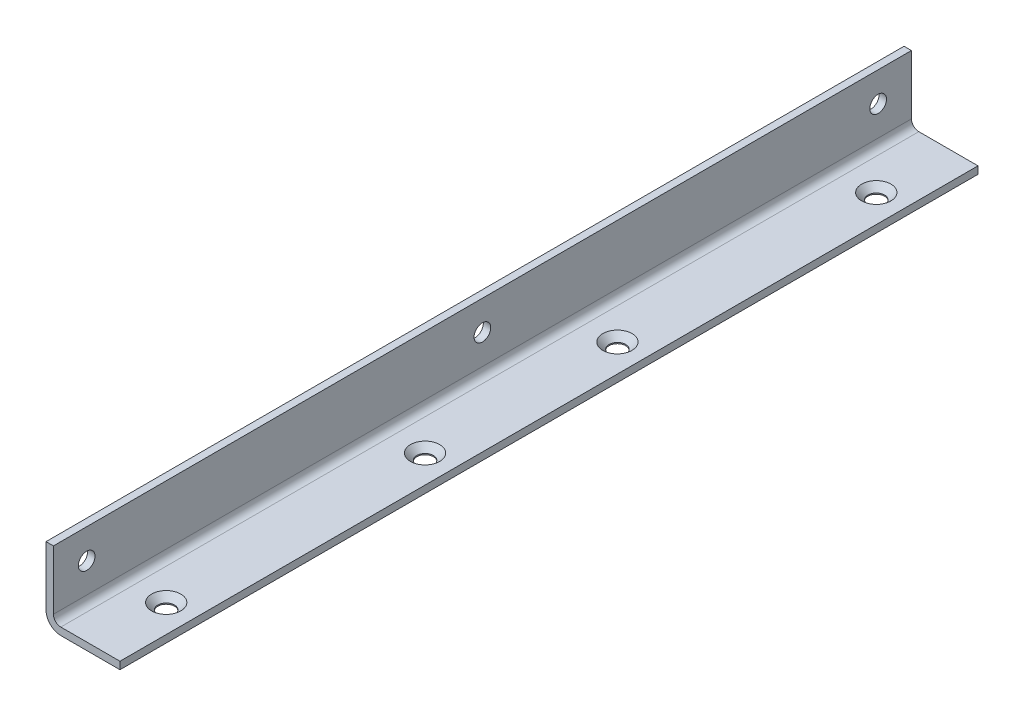
ISO-10303-21;
HEADER;
FILE_DESCRIPTION(('STEP AP214'),'2;1');
FILE_NAME('part.step','',(''),(''),'','','');
FILE_SCHEMA(('AUTOMOTIVE_DESIGN { 1 0 10303 214 1 1 1 1 }'));
ENDSEC;
DATA;
#1=APPLICATION_CONTEXT('core data for automotive mechanical design processes');
#2=APPLICATION_PROTOCOL_DEFINITION('international standard','automotive_design',2000,#1);
#3=PRODUCT_CONTEXT('',#1,'mechanical');
#4=PRODUCT('Part','Part','',(#3));
#5=PRODUCT_RELATED_PRODUCT_CATEGORY('part','',(#4));
#6=PRODUCT_DEFINITION_FORMATION('','',#4);
#7=PRODUCT_DEFINITION_CONTEXT('part definition',#1,'design');
#8=PRODUCT_DEFINITION('design','',#6,#7);
#9=PRODUCT_DEFINITION_SHAPE('','',#8);
#10=(LENGTH_UNIT() NAMED_UNIT(*) SI_UNIT(.MILLI.,.METRE.));
#11=(NAMED_UNIT(*) PLANE_ANGLE_UNIT() SI_UNIT($,.RADIAN.));
#12=(NAMED_UNIT(*) SI_UNIT($,.STERADIAN.) SOLID_ANGLE_UNIT());
#13=UNCERTAINTY_MEASURE_WITH_UNIT(LENGTH_MEASURE(1.E-05),#10,'distance_accuracy_value','');
#14=(GEOMETRIC_REPRESENTATION_CONTEXT(3) GLOBAL_UNCERTAINTY_ASSIGNED_CONTEXT((#13)) GLOBAL_UNIT_ASSIGNED_CONTEXT((#10,
#11,#12)) REPRESENTATION_CONTEXT('',''));
#15=CARTESIAN_POINT('',(0.,0.,0.));
#16=DIRECTION('',(0.,0.,1.));
#17=DIRECTION('',(1.,0.,0.));
#18=AXIS2_PLACEMENT_3D('',#15,#16,#17);
#19=CARTESIAN_POINT('',(0.,0.,232.));
#20=DIRECTION('',(1.,0.,0.));
#21=DIRECTION('',(0.,0.,-1.));
#22=AXIS2_PLACEMENT_3D('',#19,#20,#21);
#23=PLANE('',#22);
#24=CARTESIAN_POINT('',(0.,12.,116.));
#25=DIRECTION('',(1.,0.,0.));
#26=DIRECTION('',(0.,0.,-1.));
#27=AXIS2_PLACEMENT_3D('',#24,#25,#26);
#28=CIRCLE('',#27,2.25);
#29=CARTESIAN_POINT('',(0.,12.,113.75));
#30=VERTEX_POINT('',#29);
#31=EDGE_CURVE('E276',#30,#30,#28,.T.);
#32=ORIENTED_EDGE('',*,*,#31,.T.);
#33=EDGE_LOOP('',(#32));
#34=FACE_BOUND('',#33,.T.);
#35=CARTESIAN_POINT('',(0.,12.,9.00000000000007));
#36=DIRECTION('',(1.,0.,0.));
#37=DIRECTION('',(0.,0.,-1.));
#38=AXIS2_PLACEMENT_3D('',#35,#36,#37);
#39=CIRCLE('',#38,2.25);
#40=CARTESIAN_POINT('',(0.,12.,6.75000000000007));
#41=VERTEX_POINT('',#40);
#42=EDGE_CURVE('E281',#41,#41,#39,.T.);
#43=ORIENTED_EDGE('',*,*,#42,.T.);
#44=EDGE_LOOP('',(#43));
#45=FACE_BOUND('',#44,.T.);
#46=CARTESIAN_POINT('',(0.,12.,223.));
#47=DIRECTION('',(1.,0.,0.));
#48=DIRECTION('',(0.,0.,-1.));
#49=AXIS2_PLACEMENT_3D('',#46,#47,#48);
#50=CIRCLE('',#49,2.25000000000001);
#51=CARTESIAN_POINT('',(0.,12.,220.75));
#52=VERTEX_POINT('',#51);
#53=EDGE_CURVE('E147',#52,#52,#50,.T.);
#54=ORIENTED_EDGE('',*,*,#53,.T.);
#55=EDGE_LOOP('',(#54));
#56=FACE_BOUND('',#55,.T.);
#57=DIRECTION('',(0.,-1.,0.));
#58=VECTOR('',#57,1.);
#59=CARTESIAN_POINT('',(0.,0.,0.));
#60=LINE('',#59,#58);
#61=CARTESIAN_POINT('',(0.,20.,0.));
#62=VERTEX_POINT('',#61);
#63=CARTESIAN_POINT('',(0.,4.,0.));
#64=VERTEX_POINT('',#63);
#65=EDGE_CURVE('E145',#62,#64,#60,.T.);
#66=ORIENTED_EDGE('',*,*,#65,.T.);
#67=DIRECTION('',(0.,0.,-1.));
#68=VECTOR('',#67,1.);
#69=CARTESIAN_POINT('',(0.,4.,232.));
#70=LINE('',#69,#68);
#71=CARTESIAN_POINT('',(0.,4.,232.));
#72=VERTEX_POINT('',#71);
#73=EDGE_CURVE('E53',#64,#72,#70,.F.);
#74=ORIENTED_EDGE('',*,*,#73,.T.);
#75=DIRECTION('',(0.,-1.,0.));
#76=VECTOR('',#75,1.);
#77=CARTESIAN_POINT('',(0.,0.,232.));
#78=LINE('',#77,#76);
#79=CARTESIAN_POINT('',(0.,20.,232.));
#80=VERTEX_POINT('',#79);
#81=EDGE_CURVE('E119',#80,#72,#78,.T.);
#82=ORIENTED_EDGE('',*,*,#81,.F.);
#83=DIRECTION('',(0.,0.,-1.));
#84=VECTOR('',#83,1.);
#85=CARTESIAN_POINT('',(0.,20.,232.));
#86=LINE('',#85,#84);
#87=EDGE_CURVE('E144',#80,#62,#86,.T.);
#88=ORIENTED_EDGE('',*,*,#87,.T.);
#89=EDGE_LOOP('',(#66,#74,#82,#88));
#90=FACE_BOUND('',#89,.T.);
#91=ADVANCED_FACE('F45',(#34,#45,#56,#90),#23,.F.);
#92=CARTESIAN_POINT('',(0.,0.,232.));
#93=DIRECTION('',(0.,1.,0.));
#94=DIRECTION('',(0.,0.,1.));
#95=AXIS2_PLACEMENT_3D('',#92,#93,#94);
#96=PLANE('',#95);
#97=CARTESIAN_POINT('',(12.5,0.,90.));
#98=DIRECTION('',(0.,1.,0.));
#99=DIRECTION('',(0.,0.,1.));
#100=AXIS2_PLACEMENT_3D('',#97,#98,#99);
#101=CIRCLE('',#100,2.25);
#102=CARTESIAN_POINT('',(12.5,0.,92.25));
#103=VERTEX_POINT('',#102);
#104=EDGE_CURVE('E270',#103,#103,#101,.T.);
#105=ORIENTED_EDGE('',*,*,#104,.T.);
#106=EDGE_LOOP('',(#105));
#107=FACE_BOUND('',#106,.T.);
#108=CARTESIAN_POINT('',(12.5,0.,20.));
#109=DIRECTION('',(0.,1.,0.));
#110=DIRECTION('',(0.,0.,1.));
#111=AXIS2_PLACEMENT_3D('',#108,#109,#110);
#112=CIRCLE('',#111,2.25);
#113=CARTESIAN_POINT('',(12.5,0.,22.25));
#114=VERTEX_POINT('',#113);
#115=EDGE_CURVE('E264',#114,#114,#112,.T.);
#116=ORIENTED_EDGE('',*,*,#115,.T.);
#117=EDGE_LOOP('',(#116));
#118=FACE_BOUND('',#117,.T.);
#119=CARTESIAN_POINT('',(12.5,0.,142.));
#120=DIRECTION('',(0.,1.,0.));
#121=DIRECTION('',(0.,0.,1.));
#122=AXIS2_PLACEMENT_3D('',#119,#120,#121);
#123=CIRCLE('',#122,2.25);
#124=CARTESIAN_POINT('',(12.5,0.,144.25));
#125=VERTEX_POINT('',#124);
#126=EDGE_CURVE('E261',#125,#125,#123,.T.);
#127=ORIENTED_EDGE('',*,*,#126,.T.);
#128=EDGE_LOOP('',(#127));
#129=FACE_BOUND('',#128,.T.);
#130=CARTESIAN_POINT('',(12.5,0.,212.));
#131=DIRECTION('',(0.,1.,0.));
#132=DIRECTION('',(0.,0.,1.));
#133=AXIS2_PLACEMENT_3D('',#130,#131,#132);
#134=CIRCLE('',#133,2.25);
#135=CARTESIAN_POINT('',(12.5,0.,214.25));
#136=VERTEX_POINT('',#135);
#137=EDGE_CURVE('E263',#136,#136,#134,.T.);
#138=ORIENTED_EDGE('',*,*,#137,.T.);
#139=EDGE_LOOP('',(#138));
#140=FACE_BOUND('',#139,.T.);
#141=DIRECTION('',(1.,0.,0.));
#142=VECTOR('',#141,1.);
#143=CARTESIAN_POINT('',(0.,0.,232.));
#144=LINE('',#143,#142);
#145=CARTESIAN_POINT('',(4.,0.,232.));
#146=VERTEX_POINT('',#145);
#147=CARTESIAN_POINT('',(20.,0.,232.));
#148=VERTEX_POINT('',#147);
#149=EDGE_CURVE('E109',#146,#148,#144,.T.);
#150=ORIENTED_EDGE('',*,*,#149,.F.);
#151=DIRECTION('',(0.,0.,-1.));
#152=VECTOR('',#151,1.);
#153=CARTESIAN_POINT('',(4.,0.,232.));
#154=LINE('',#153,#152);
#155=CARTESIAN_POINT('',(4.,0.,0.));
#156=VERTEX_POINT('',#155);
#157=EDGE_CURVE('E194',#146,#156,#154,.T.);
#158=ORIENTED_EDGE('',*,*,#157,.T.);
#159=DIRECTION('',(1.,0.,0.));
#160=VECTOR('',#159,1.);
#161=CARTESIAN_POINT('',(0.,0.,0.));
#162=LINE('',#161,#160);
#163=CARTESIAN_POINT('',(20.,0.,0.));
#164=VERTEX_POINT('',#163);
#165=EDGE_CURVE('E124',#156,#164,#162,.T.);
#166=ORIENTED_EDGE('',*,*,#165,.T.);
#167=DIRECTION('',(0.,0.,-1.));
#168=VECTOR('',#167,1.);
#169=CARTESIAN_POINT('',(20.,0.,232.));
#170=LINE('',#169,#168);
#171=EDGE_CURVE('E122',#148,#164,#170,.T.);
#172=ORIENTED_EDGE('',*,*,#171,.F.);
#173=EDGE_LOOP('',(#150,#158,#166,#172));
#174=FACE_BOUND('',#173,.T.);
#175=ADVANCED_FACE('F123',(#107,#118,#129,#140,#174),#96,.F.);
#176=CARTESIAN_POINT('',(20.,0.,232.));
#177=DIRECTION('',(-1.,0.,0.));
#178=DIRECTION('',(0.,0.,1.));
#179=AXIS2_PLACEMENT_3D('',#176,#177,#178);
#180=PLANE('',#179);
#181=DIRECTION('',(0.,1.,0.));
#182=VECTOR('',#181,1.);
#183=CARTESIAN_POINT('',(20.,0.,0.));
#184=LINE('',#183,#182);
#185=CARTESIAN_POINT('',(20.,2.,0.));
#186=VERTEX_POINT('',#185);
#187=EDGE_CURVE('E149',#164,#186,#184,.T.);
#188=ORIENTED_EDGE('',*,*,#187,.T.);
#189=DIRECTION('',(0.,0.,-1.));
#190=VECTOR('',#189,1.);
#191=CARTESIAN_POINT('',(20.,2.,232.));
#192=LINE('',#191,#190);
#193=CARTESIAN_POINT('',(20.,2.,232.));
#194=VERTEX_POINT('',#193);
#195=EDGE_CURVE('E128',#194,#186,#192,.T.);
#196=ORIENTED_EDGE('',*,*,#195,.F.);
#197=DIRECTION('',(0.,1.,0.));
#198=VECTOR('',#197,1.);
#199=CARTESIAN_POINT('',(20.,0.,232.));
#200=LINE('',#199,#198);
#201=EDGE_CURVE('E113',#148,#194,#200,.T.);
#202=ORIENTED_EDGE('',*,*,#201,.F.);
#203=ORIENTED_EDGE('',*,*,#171,.T.);
#204=EDGE_LOOP('',(#188,#196,#202,#203));
#205=FACE_BOUND('',#204,.T.);
#206=ADVANCED_FACE('F130',(#205),#180,.F.);
#207=CARTESIAN_POINT('',(4.00000000000001,2.,232.));
#208=DIRECTION('',(0.,-1.,0.));
#209=DIRECTION('',(0.,0.,-1.));
#210=AXIS2_PLACEMENT_3D('',#207,#208,#209);
#211=PLANE('',#210);
#212=CARTESIAN_POINT('',(12.5,2.,20.));
#213=DIRECTION('',(0.,-1.,0.));
#214=DIRECTION('',(0.,0.,-1.));
#215=AXIS2_PLACEMENT_3D('',#212,#213,#214);
#216=CIRCLE('',#215,3.95000000000001);
#217=CARTESIAN_POINT('',(12.5,2.,16.05));
#218=VERTEX_POINT('',#217);
#219=EDGE_CURVE('E182',#218,#218,#216,.T.);
#220=ORIENTED_EDGE('',*,*,#219,.T.);
#221=EDGE_LOOP('',(#220));
#222=FACE_BOUND('',#221,.T.);
#223=CARTESIAN_POINT('',(12.5,2.,90.));
#224=DIRECTION('',(0.,-1.,0.));
#225=DIRECTION('',(0.,0.,-1.));
#226=AXIS2_PLACEMENT_3D('',#223,#224,#225);
#227=CIRCLE('',#226,3.95000000000001);
#228=CARTESIAN_POINT('',(12.5,2.,86.05));
#229=VERTEX_POINT('',#228);
#230=EDGE_CURVE('E179',#229,#229,#227,.T.);
#231=ORIENTED_EDGE('',*,*,#230,.T.);
#232=EDGE_LOOP('',(#231));
#233=FACE_BOUND('',#232,.T.);
#234=CARTESIAN_POINT('',(12.5,2.,142.));
#235=DIRECTION('',(0.,-1.,0.));
#236=DIRECTION('',(0.,0.,-1.));
#237=AXIS2_PLACEMENT_3D('',#234,#235,#236);
#238=CIRCLE('',#237,3.95000000000001);
#239=CARTESIAN_POINT('',(12.5,2.,138.05));
#240=VERTEX_POINT('',#239);
#241=EDGE_CURVE('E176',#240,#240,#238,.T.);
#242=ORIENTED_EDGE('',*,*,#241,.T.);
#243=EDGE_LOOP('',(#242));
#244=FACE_BOUND('',#243,.T.);
#245=CARTESIAN_POINT('',(12.5,2.,212.));
#246=DIRECTION('',(0.,-1.,0.));
#247=DIRECTION('',(0.,0.,-1.));
#248=AXIS2_PLACEMENT_3D('',#245,#246,#247);
#249=CIRCLE('',#248,3.95000000000001);
#250=CARTESIAN_POINT('',(12.5,2.,208.05));
#251=VERTEX_POINT('',#250);
#252=EDGE_CURVE('E173',#251,#251,#249,.T.);
#253=ORIENTED_EDGE('',*,*,#252,.T.);
#254=EDGE_LOOP('',(#253));
#255=FACE_BOUND('',#254,.T.);
#256=DIRECTION('',(-1.,0.,0.));
#257=VECTOR('',#256,1.);
#258=CARTESIAN_POINT('',(4.00000000000001,2.,0.));
#259=LINE('',#258,#257);
#260=CARTESIAN_POINT('',(4.00000000000001,2.,0.));
#261=VERTEX_POINT('',#260);
#262=EDGE_CURVE('E151',#186,#261,#259,.T.);
#263=ORIENTED_EDGE('',*,*,#262,.T.);
#264=DIRECTION('',(0.,0.,-1.));
#265=VECTOR('',#264,1.);
#266=CARTESIAN_POINT('',(4.00000000000001,2.,232.));
#267=LINE('',#266,#265);
#268=CARTESIAN_POINT('',(4.00000000000001,2.,232.));
#269=VERTEX_POINT('',#268);
#270=EDGE_CURVE('E167',#269,#261,#267,.T.);
#271=ORIENTED_EDGE('',*,*,#270,.F.);
#272=DIRECTION('',(-1.,0.,0.));
#273=VECTOR('',#272,1.);
#274=CARTESIAN_POINT('',(4.00000000000001,2.,232.));
#275=LINE('',#274,#273);
#276=EDGE_CURVE('E133',#194,#269,#275,.T.);
#277=ORIENTED_EDGE('',*,*,#276,.F.);
#278=ORIENTED_EDGE('',*,*,#195,.T.);
#279=EDGE_LOOP('',(#263,#271,#277,#278));
#280=FACE_BOUND('',#279,.T.);
#281=ADVANCED_FACE('F201',(#222,#233,#244,#255,#280),#211,.F.);
#282=CARTESIAN_POINT('',(4.,4.,232.));
#283=DIRECTION('',(0.,0.,-1.));
#284=DIRECTION('',(-1.,0.,0.));
#285=AXIS2_PLACEMENT_3D('',#282,#283,#284);
#286=CYLINDRICAL_SURFACE('',#285,2.);
#287=CARTESIAN_POINT('',(4.,4.,0.));
#288=DIRECTION('',(0.,0.,-1.));
#289=DIRECTION('',(-1.,0.,0.));
#290=AXIS2_PLACEMENT_3D('',#287,#288,#289);
#291=CIRCLE('',#290,2.);
#292=CARTESIAN_POINT('',(2.,4.00000000000001,0.));
#293=VERTEX_POINT('',#292);
#294=EDGE_CURVE('E153',#261,#293,#291,.T.);
#295=ORIENTED_EDGE('',*,*,#294,.T.);
#296=DIRECTION('',(0.,0.,-1.));
#297=VECTOR('',#296,1.);
#298=CARTESIAN_POINT('',(2.,4.00000000000001,232.));
#299=LINE('',#298,#297);
#300=CARTESIAN_POINT('',(2.,4.00000000000001,232.));
#301=VERTEX_POINT('',#300);
#302=EDGE_CURVE('E164',#301,#293,#299,.T.);
#303=ORIENTED_EDGE('',*,*,#302,.F.);
#304=CARTESIAN_POINT('',(4.,4.,232.));
#305=DIRECTION('',(0.,0.,-1.));
#306=DIRECTION('',(-1.,0.,0.));
#307=AXIS2_PLACEMENT_3D('',#304,#305,#306);
#308=CIRCLE('',#307,2.);
#309=EDGE_CURVE('E135',#269,#301,#308,.T.);
#310=ORIENTED_EDGE('',*,*,#309,.F.);
#311=ORIENTED_EDGE('',*,*,#270,.T.);
#312=EDGE_LOOP('',(#295,#303,#310,#311));
#313=FACE_BOUND('',#312,.T.);
#314=ADVANCED_FACE('F208',(#313),#286,.F.);
#315=CARTESIAN_POINT('',(2.,4.00000000000001,232.));
#316=DIRECTION('',(-1.,0.,0.));
#317=DIRECTION('',(0.,0.,1.));
#318=AXIS2_PLACEMENT_3D('',#315,#316,#317);
#319=PLANE('',#318);
#320=CARTESIAN_POINT('',(2.,12.,116.));
#321=DIRECTION('',(1.,0.,0.));
#322=DIRECTION('',(0.,0.,-1.));
#323=AXIS2_PLACEMENT_3D('',#320,#321,#322);
#324=CIRCLE('',#323,2.25);
#325=CARTESIAN_POINT('',(2.,12.,113.75));
#326=VERTEX_POINT('',#325);
#327=EDGE_CURVE('E267',#326,#326,#324,.T.);
#328=ORIENTED_EDGE('',*,*,#327,.F.);
#329=EDGE_LOOP('',(#328));
#330=FACE_BOUND('',#329,.T.);
#331=CARTESIAN_POINT('',(2.,12.,9.00000000000007));
#332=DIRECTION('',(1.,0.,0.));
#333=DIRECTION('',(0.,0.,1.));
#334=AXIS2_PLACEMENT_3D('',#331,#332,#333);
#335=CIRCLE('',#334,2.25);
#336=CARTESIAN_POINT('',(2.,12.,11.2500000000001));
#337=VERTEX_POINT('',#336);
#338=EDGE_CURVE('E278',#337,#337,#335,.T.);
#339=ORIENTED_EDGE('',*,*,#338,.F.);
#340=EDGE_LOOP('',(#339));
#341=FACE_BOUND('',#340,.T.);
#342=CARTESIAN_POINT('',(2.,12.,223.));
#343=DIRECTION('',(1.,0.,0.));
#344=DIRECTION('',(0.,0.,-1.));
#345=AXIS2_PLACEMENT_3D('',#342,#343,#344);
#346=CIRCLE('',#345,2.25000000000001);
#347=CARTESIAN_POINT('',(2.,12.,220.75));
#348=VERTEX_POINT('',#347);
#349=EDGE_CURVE('E284',#348,#348,#346,.T.);
#350=ORIENTED_EDGE('',*,*,#349,.F.);
#351=EDGE_LOOP('',(#350));
#352=FACE_BOUND('',#351,.T.);
#353=DIRECTION('',(0.,1.,0.));
#354=VECTOR('',#353,1.);
#355=CARTESIAN_POINT('',(2.,4.00000000000001,0.));
#356=LINE('',#355,#354);
#357=CARTESIAN_POINT('',(2.,20.,0.));
#358=VERTEX_POINT('',#357);
#359=EDGE_CURVE('E155',#293,#358,#356,.T.);
#360=ORIENTED_EDGE('',*,*,#359,.T.);
#361=DIRECTION('',(0.,0.,-1.));
#362=VECTOR('',#361,1.);
#363=CARTESIAN_POINT('',(2.,20.,232.));
#364=LINE('',#363,#362);
#365=CARTESIAN_POINT('',(2.,20.,232.));
#366=VERTEX_POINT('',#365);
#367=EDGE_CURVE('E161',#366,#358,#364,.T.);
#368=ORIENTED_EDGE('',*,*,#367,.F.);
#369=DIRECTION('',(0.,1.,0.));
#370=VECTOR('',#369,1.);
#371=CARTESIAN_POINT('',(2.,4.00000000000001,232.));
#372=LINE('',#371,#370);
#373=EDGE_CURVE('E140',#301,#366,#372,.T.);
#374=ORIENTED_EDGE('',*,*,#373,.F.);
#375=ORIENTED_EDGE('',*,*,#302,.T.);
#376=EDGE_LOOP('',(#360,#368,#374,#375));
#377=FACE_BOUND('',#376,.T.);
#378=ADVANCED_FACE('F211',(#330,#341,#352,#377),#319,.F.);
#379=CARTESIAN_POINT('',(0.,20.,232.));
#380=DIRECTION('',(0.,-1.,0.));
#381=DIRECTION('',(0.,0.,-1.));
#382=AXIS2_PLACEMENT_3D('',#379,#380,#381);
#383=PLANE('',#382);
#384=DIRECTION('',(-1.,0.,0.));
#385=VECTOR('',#384,1.);
#386=CARTESIAN_POINT('',(0.,20.,0.));
#387=LINE('',#386,#385);
#388=EDGE_CURVE('E157',#358,#62,#387,.T.);
#389=ORIENTED_EDGE('',*,*,#388,.T.);
#390=ORIENTED_EDGE('',*,*,#87,.F.);
#391=DIRECTION('',(-1.,0.,0.));
#392=VECTOR('',#391,1.);
#393=CARTESIAN_POINT('',(0.,20.,232.));
#394=LINE('',#393,#392);
#395=EDGE_CURVE('E142',#366,#80,#394,.T.);
#396=ORIENTED_EDGE('',*,*,#395,.F.);
#397=ORIENTED_EDGE('',*,*,#367,.T.);
#398=EDGE_LOOP('',(#389,#390,#396,#397));
#399=FACE_BOUND('',#398,.T.);
#400=ADVANCED_FACE('F216',(#399),#383,.F.);
#401=CARTESIAN_POINT('',(4.,4.,232.));
#402=DIRECTION('',(0.,0.,-1.));
#403=DIRECTION('',(-1.,0.,0.));
#404=AXIS2_PLACEMENT_3D('',#401,#402,#403);
#405=PLANE('',#404);
#406=ORIENTED_EDGE('',*,*,#81,.T.);
#407=CARTESIAN_POINT('',(4.,4.,232.));
#408=DIRECTION('',(0.,0.,-1.));
#409=DIRECTION('',(-1.,0.,0.));
#410=AXIS2_PLACEMENT_3D('',#407,#408,#409);
#411=CIRCLE('',#410,4.);
#412=EDGE_CURVE('E13',#72,#146,#411,.F.);
#413=ORIENTED_EDGE('',*,*,#412,.T.);
#414=ORIENTED_EDGE('',*,*,#149,.T.);
#415=ORIENTED_EDGE('',*,*,#201,.T.);
#416=ORIENTED_EDGE('',*,*,#276,.T.);
#417=ORIENTED_EDGE('',*,*,#309,.T.);
#418=ORIENTED_EDGE('',*,*,#373,.T.);
#419=ORIENTED_EDGE('',*,*,#395,.T.);
#420=EDGE_LOOP('',(#406,#413,#414,#415,#416,#417,#418,#419));
#421=FACE_BOUND('',#420,.T.);
#422=ADVANCED_FACE('F111',(#421),#405,.F.);
#423=CARTESIAN_POINT('',(4.,4.,0.));
#424=DIRECTION('',(0.,0.,-1.));
#425=DIRECTION('',(-1.,0.,0.));
#426=AXIS2_PLACEMENT_3D('',#423,#424,#425);
#427=PLANE('',#426);
#428=ORIENTED_EDGE('',*,*,#165,.F.);
#429=CARTESIAN_POINT('',(4.,4.,0.));
#430=DIRECTION('',(0.,0.,-1.));
#431=DIRECTION('',(-1.,0.,0.));
#432=AXIS2_PLACEMENT_3D('',#429,#430,#431);
#433=CIRCLE('',#432,4.);
#434=EDGE_CURVE('E67',#156,#64,#433,.T.);
#435=ORIENTED_EDGE('',*,*,#434,.T.);
#436=ORIENTED_EDGE('',*,*,#65,.F.);
#437=ORIENTED_EDGE('',*,*,#388,.F.);
#438=ORIENTED_EDGE('',*,*,#359,.F.);
#439=ORIENTED_EDGE('',*,*,#294,.F.);
#440=ORIENTED_EDGE('',*,*,#262,.F.);
#441=ORIENTED_EDGE('',*,*,#187,.F.);
#442=EDGE_LOOP('',(#428,#435,#436,#437,#438,#439,#440,#441));
#443=FACE_BOUND('',#442,.T.);
#444=ADVANCED_FACE('F197',(#443),#427,.T.);
#445=CARTESIAN_POINT('',(-8.,12.,223.));
#446=DIRECTION('',(1.,0.,0.));
#447=DIRECTION('',(0.,0.,-1.));
#448=AXIS2_PLACEMENT_3D('',#445,#446,#447);
#449=CYLINDRICAL_SURFACE('',#448,2.25000000000001);
#450=ORIENTED_EDGE('',*,*,#349,.T.);
#451=EDGE_LOOP('',(#450));
#452=FACE_BOUND('',#451,.T.);
#453=ORIENTED_EDGE('',*,*,#53,.F.);
#454=EDGE_LOOP('',(#453));
#455=FACE_BOUND('',#454,.T.);
#456=ADVANCED_FACE('F291',(#452,#455),#449,.F.);
#457=CARTESIAN_POINT('',(-8.,12.,9.00000000000007));
#458=DIRECTION('',(1.,0.,0.));
#459=DIRECTION('',(0.,0.,-1.));
#460=AXIS2_PLACEMENT_3D('',#457,#458,#459);
#461=CYLINDRICAL_SURFACE('',#460,2.25);
#462=ORIENTED_EDGE('',*,*,#338,.T.);
#463=EDGE_LOOP('',(#462));
#464=FACE_BOUND('',#463,.T.);
#465=ORIENTED_EDGE('',*,*,#42,.F.);
#466=EDGE_LOOP('',(#465));
#467=FACE_BOUND('',#466,.T.);
#468=ADVANCED_FACE('F293',(#464,#467),#461,.F.);
#469=CARTESIAN_POINT('',(-8.,12.,116.));
#470=DIRECTION('',(1.,0.,0.));
#471=DIRECTION('',(0.,0.,-1.));
#472=AXIS2_PLACEMENT_3D('',#469,#470,#471);
#473=CYLINDRICAL_SURFACE('',#472,2.25);
#474=ORIENTED_EDGE('',*,*,#327,.T.);
#475=EDGE_LOOP('',(#474));
#476=FACE_BOUND('',#475,.T.);
#477=ORIENTED_EDGE('',*,*,#31,.F.);
#478=EDGE_LOOP('',(#477));
#479=FACE_BOUND('',#478,.T.);
#480=ADVANCED_FACE('F300',(#476,#479),#473,.F.);
#481=CARTESIAN_POINT('',(12.5,-8.,212.));
#482=DIRECTION('',(0.,1.,0.));
#483=DIRECTION('',(0.,0.,1.));
#484=AXIS2_PLACEMENT_3D('',#481,#482,#483);
#485=CYLINDRICAL_SURFACE('',#484,2.25);
#486=CARTESIAN_POINT('',(12.5,0.300000000000016,212.));
#487=DIRECTION('',(0.,-1.,0.));
#488=DIRECTION('',(0.,0.,-1.));
#489=AXIS2_PLACEMENT_3D('',#486,#487,#488);
#490=CIRCLE('',#489,2.25);
#491=CARTESIAN_POINT('',(12.5,0.300000000000016,209.75));
#492=VERTEX_POINT('',#491);
#493=EDGE_CURVE('E191',#492,#492,#490,.F.);
#494=ORIENTED_EDGE('',*,*,#493,.T.);
#495=EDGE_LOOP('',(#494));
#496=FACE_BOUND('',#495,.T.);
#497=ORIENTED_EDGE('',*,*,#137,.F.);
#498=EDGE_LOOP('',(#497));
#499=FACE_BOUND('',#498,.T.);
#500=ADVANCED_FACE('F257',(#496,#499),#485,.F.);
#501=CARTESIAN_POINT('',(12.5,-8.,142.));
#502=DIRECTION('',(0.,1.,0.));
#503=DIRECTION('',(0.,0.,1.));
#504=AXIS2_PLACEMENT_3D('',#501,#502,#503);
#505=CYLINDRICAL_SURFACE('',#504,2.25);
#506=CARTESIAN_POINT('',(12.5,0.300000000000016,142.));
#507=DIRECTION('',(0.,-1.,0.));
#508=DIRECTION('',(0.,0.,-1.));
#509=AXIS2_PLACEMENT_3D('',#506,#507,#508);
#510=CIRCLE('',#509,2.25);
#511=CARTESIAN_POINT('',(12.5,0.300000000000016,139.75));
#512=VERTEX_POINT('',#511);
#513=EDGE_CURVE('E188',#512,#512,#510,.F.);
#514=ORIENTED_EDGE('',*,*,#513,.T.);
#515=EDGE_LOOP('',(#514));
#516=FACE_BOUND('',#515,.T.);
#517=ORIENTED_EDGE('',*,*,#126,.F.);
#518=EDGE_LOOP('',(#517));
#519=FACE_BOUND('',#518,.T.);
#520=ADVANCED_FACE('F253',(#516,#519),#505,.F.);
#521=CARTESIAN_POINT('',(12.5,-8.,20.));
#522=DIRECTION('',(0.,1.,0.));
#523=DIRECTION('',(0.,0.,1.));
#524=AXIS2_PLACEMENT_3D('',#521,#522,#523);
#525=CYLINDRICAL_SURFACE('',#524,2.25);
#526=CARTESIAN_POINT('',(12.5,0.300000000000016,20.));
#527=DIRECTION('',(0.,-1.,0.));
#528=DIRECTION('',(0.,0.,-1.));
#529=AXIS2_PLACEMENT_3D('',#526,#527,#528);
#530=CIRCLE('',#529,2.25);
#531=CARTESIAN_POINT('',(12.5,0.300000000000016,17.75));
#532=VERTEX_POINT('',#531);
#533=EDGE_CURVE('E127',#532,#532,#530,.F.);
#534=ORIENTED_EDGE('',*,*,#533,.T.);
#535=EDGE_LOOP('',(#534));
#536=FACE_BOUND('',#535,.T.);
#537=ORIENTED_EDGE('',*,*,#115,.F.);
#538=EDGE_LOOP('',(#537));
#539=FACE_BOUND('',#538,.T.);
#540=ADVANCED_FACE('F256',(#536,#539),#525,.F.);
#541=CARTESIAN_POINT('',(12.5,-8.,90.));
#542=DIRECTION('',(0.,1.,0.));
#543=DIRECTION('',(0.,0.,1.));
#544=AXIS2_PLACEMENT_3D('',#541,#542,#543);
#545=CYLINDRICAL_SURFACE('',#544,2.25);
#546=CARTESIAN_POINT('',(12.5,0.300000000000016,90.));
#547=DIRECTION('',(0.,-1.,0.));
#548=DIRECTION('',(0.,0.,-1.));
#549=AXIS2_PLACEMENT_3D('',#546,#547,#548);
#550=CIRCLE('',#549,2.25);
#551=CARTESIAN_POINT('',(12.5,0.300000000000016,87.75));
#552=VERTEX_POINT('',#551);
#553=EDGE_CURVE('E185',#552,#552,#550,.F.);
#554=ORIENTED_EDGE('',*,*,#553,.T.);
#555=EDGE_LOOP('',(#554));
#556=FACE_BOUND('',#555,.T.);
#557=ORIENTED_EDGE('',*,*,#104,.F.);
#558=EDGE_LOOP('',(#557));
#559=FACE_BOUND('',#558,.T.);
#560=ADVANCED_FACE('F240',(#556,#559),#545,.F.);
#561=CARTESIAN_POINT('',(12.5,0.300000000000016,20.));
#562=DIRECTION('',(0.,1.,0.));
#563=DIRECTION('',(0.,0.,1.));
#564=AXIS2_PLACEMENT_3D('',#561,#562,#563);
#565=CONICAL_SURFACE('',#564,2.25,0.785398163397454);
#566=ORIENTED_EDGE('',*,*,#219,.F.);
#567=EDGE_LOOP('',(#566));
#568=FACE_BOUND('',#567,.T.);
#569=ORIENTED_EDGE('',*,*,#533,.F.);
#570=EDGE_LOOP('',(#569));
#571=FACE_BOUND('',#570,.T.);
#572=ADVANCED_FACE('F236',(#568,#571),#565,.F.);
#573=CARTESIAN_POINT('',(12.5,0.300000000000016,90.));
#574=DIRECTION('',(0.,1.,0.));
#575=DIRECTION('',(0.,0.,1.));
#576=AXIS2_PLACEMENT_3D('',#573,#574,#575);
#577=CONICAL_SURFACE('',#576,2.25,0.785398163397454);
#578=ORIENTED_EDGE('',*,*,#230,.F.);
#579=EDGE_LOOP('',(#578));
#580=FACE_BOUND('',#579,.T.);
#581=ORIENTED_EDGE('',*,*,#553,.F.);
#582=EDGE_LOOP('',(#581));
#583=FACE_BOUND('',#582,.T.);
#584=ADVANCED_FACE('F239',(#580,#583),#577,.F.);
#585=CARTESIAN_POINT('',(12.5,0.300000000000016,142.));
#586=DIRECTION('',(0.,1.,0.));
#587=DIRECTION('',(0.,0.,1.));
#588=AXIS2_PLACEMENT_3D('',#585,#586,#587);
#589=CONICAL_SURFACE('',#588,2.25,0.785398163397454);
#590=ORIENTED_EDGE('',*,*,#241,.F.);
#591=EDGE_LOOP('',(#590));
#592=FACE_BOUND('',#591,.T.);
#593=ORIENTED_EDGE('',*,*,#513,.F.);
#594=EDGE_LOOP('',(#593));
#595=FACE_BOUND('',#594,.T.);
#596=ADVANCED_FACE('F222',(#592,#595),#589,.F.);
#597=CARTESIAN_POINT('',(12.5,0.300000000000016,212.));
#598=DIRECTION('',(0.,1.,0.));
#599=DIRECTION('',(0.,0.,1.));
#600=AXIS2_PLACEMENT_3D('',#597,#598,#599);
#601=CONICAL_SURFACE('',#600,2.25,0.785398163397454);
#602=ORIENTED_EDGE('',*,*,#252,.F.);
#603=EDGE_LOOP('',(#602));
#604=FACE_BOUND('',#603,.T.);
#605=ORIENTED_EDGE('',*,*,#493,.F.);
#606=EDGE_LOOP('',(#605));
#607=FACE_BOUND('',#606,.T.);
#608=ADVANCED_FACE('F218',(#604,#607),#601,.F.);
#609=CARTESIAN_POINT('',(4.,4.,232.));
#610=DIRECTION('',(0.,0.,-1.));
#611=DIRECTION('',(-1.,0.,0.));
#612=AXIS2_PLACEMENT_3D('',#609,#610,#611);
#613=CYLINDRICAL_SURFACE('',#612,4.);
#614=ORIENTED_EDGE('',*,*,#412,.F.);
#615=ORIENTED_EDGE('',*,*,#73,.F.);
#616=ORIENTED_EDGE('',*,*,#434,.F.);
#617=ORIENTED_EDGE('',*,*,#157,.F.);
#618=EDGE_LOOP('',(#614,#615,#616,#617));
#619=FACE_BOUND('',#618,.T.);
#620=ADVANCED_FACE('F47',(#619),#613,.T.);
#621=CLOSED_SHELL('',(#91,#175,#206,#281,#314,#378,#400,#422,#444,#456,#468,#480,#500,#520,#540,
#560,#572,#584,#596,#608,#620));
#622=MANIFOLD_SOLID_BREP('B2',#621);
#623=ADVANCED_BREP_SHAPE_REPRESENTATION('',(#18,#622),#14);
#624=SHAPE_DEFINITION_REPRESENTATION(#9,#623);
ENDSEC;
END-ISO-10303-21;
